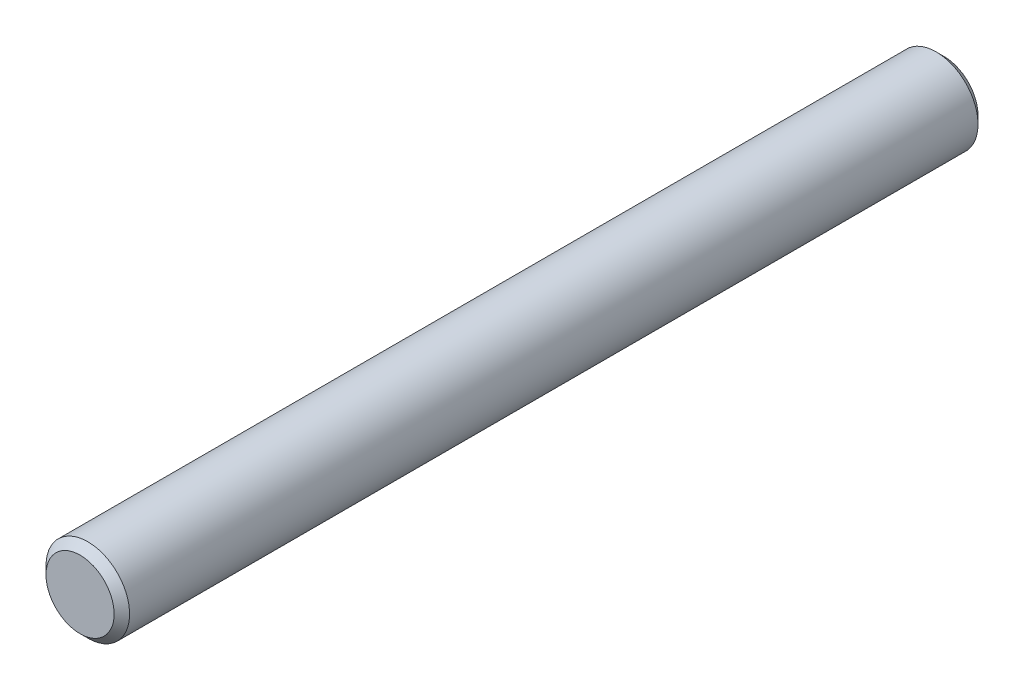
ISO-10303-21;
HEADER;
FILE_DESCRIPTION(('STEP AP214'),'2;1');
FILE_NAME('part.step','',(''),(''),'','','');
FILE_SCHEMA(('AUTOMOTIVE_DESIGN { 1 0 10303 214 1 1 1 1 }'));
ENDSEC;
DATA;
#1=APPLICATION_CONTEXT('core data for automotive mechanical design processes');
#2=APPLICATION_PROTOCOL_DEFINITION('international standard','automotive_design',2000,#1);
#3=PRODUCT_CONTEXT('',#1,'mechanical');
#4=PRODUCT('Part','Part','',(#3));
#5=PRODUCT_RELATED_PRODUCT_CATEGORY('part','',(#4));
#6=PRODUCT_DEFINITION_FORMATION('','',#4);
#7=PRODUCT_DEFINITION_CONTEXT('part definition',#1,'design');
#8=PRODUCT_DEFINITION('design','',#6,#7);
#9=PRODUCT_DEFINITION_SHAPE('','',#8);
#10=(LENGTH_UNIT() NAMED_UNIT(*) SI_UNIT(.MILLI.,.METRE.));
#11=(NAMED_UNIT(*) PLANE_ANGLE_UNIT() SI_UNIT($,.RADIAN.));
#12=(NAMED_UNIT(*) SI_UNIT($,.STERADIAN.) SOLID_ANGLE_UNIT());
#13=UNCERTAINTY_MEASURE_WITH_UNIT(LENGTH_MEASURE(1.E-05),#10,'distance_accuracy_value','');
#14=(GEOMETRIC_REPRESENTATION_CONTEXT(3) GLOBAL_UNCERTAINTY_ASSIGNED_CONTEXT((#13)) GLOBAL_UNIT_ASSIGNED_CONTEXT((#10,
#11,#12)) REPRESENTATION_CONTEXT('',''));
#15=CARTESIAN_POINT('',(0.,0.,0.));
#16=DIRECTION('',(0.,0.,1.));
#17=DIRECTION('',(1.,0.,0.));
#18=AXIS2_PLACEMENT_3D('',#15,#16,#17);
#19=CARTESIAN_POINT('',(0.,0.,21.));
#20=DIRECTION('',(0.,0.,-1.));
#21=DIRECTION('',(-1.,0.,0.));
#22=AXIS2_PLACEMENT_3D('',#19,#20,#21);
#23=CYLINDRICAL_SURFACE('',#22,3.);
#24=CARTESIAN_POINT('',(0.,0.,30.4455));
#25=DIRECTION('',(0.,0.,-1.));
#26=DIRECTION('',(-1.,0.,0.));
#27=AXIS2_PLACEMENT_3D('',#24,#25,#26);
#28=CIRCLE('',#27,3.);
#29=CARTESIAN_POINT('',(-3.,0.,30.4455));
#30=VERTEX_POINT('',#29);
#31=EDGE_CURVE('E45',#30,#30,#28,.T.);
#32=CARTESIAN_POINT('',(0.,0.,-30.4455));
#33=DIRECTION('',(0.,0.,1.));
#34=DIRECTION('',(1.,0.,0.));
#35=AXIS2_PLACEMENT_3D('',#32,#33,#34);
#36=CIRCLE('',#35,3.);
#37=CARTESIAN_POINT('',(-3.,0.,-30.4455));
#38=VERTEX_POINT('',#37);
#39=EDGE_CURVE('E53',#38,#38,#36,.T.);
#40=CARTESIAN_POINT('',(-3.,0.,30.4455));
#41=CARTESIAN_POINT('',(-3.,0.,29.81121875));
#42=CARTESIAN_POINT('',(-3.,0.,29.1769375));
#43=CARTESIAN_POINT('',(-3.,0.,27.908375));
#44=CARTESIAN_POINT('',(-3.,0.,27.27409375));
#45=CARTESIAN_POINT('',(-3.,0.,26.00553125));
#46=CARTESIAN_POINT('',(-3.,0.,25.37125));
#47=CARTESIAN_POINT('',(-3.,0.,24.1026875));
#48=CARTESIAN_POINT('',(-3.,0.,23.46840625));
#49=CARTESIAN_POINT('',(-3.,0.,22.19984375));
#50=CARTESIAN_POINT('',(-3.,0.,21.5655625));
#51=CARTESIAN_POINT('',(-3.,0.,20.297));
#52=CARTESIAN_POINT('',(-3.,0.,19.66271875));
#53=CARTESIAN_POINT('',(-3.,0.,18.39415625));
#54=CARTESIAN_POINT('',(-3.,0.,17.759875));
#55=CARTESIAN_POINT('',(-3.,0.,16.4913125));
#56=CARTESIAN_POINT('',(-3.,0.,15.85703125));
#57=CARTESIAN_POINT('',(-3.,0.,14.58846875));
#58=CARTESIAN_POINT('',(-3.,0.,13.9541875));
#59=CARTESIAN_POINT('',(-3.,0.,12.685625));
#60=CARTESIAN_POINT('',(-3.,0.,12.05134375));
#61=CARTESIAN_POINT('',(-3.,0.,10.78278125));
#62=CARTESIAN_POINT('',(-3.,0.,10.1485));
#63=CARTESIAN_POINT('',(-3.,0.,8.8799375));
#64=CARTESIAN_POINT('',(-3.,0.,8.24565625));
#65=CARTESIAN_POINT('',(-3.,0.,6.97709375));
#66=CARTESIAN_POINT('',(-3.,0.,6.3428125));
#67=CARTESIAN_POINT('',(-3.,0.,5.07425));
#68=CARTESIAN_POINT('',(-3.,0.,4.43996875));
#69=CARTESIAN_POINT('',(-3.,0.,3.17140625));
#70=CARTESIAN_POINT('',(-3.,0.,2.537125));
#71=CARTESIAN_POINT('',(-3.,0.,1.2685625));
#72=CARTESIAN_POINT('',(-3.,0.,0.63428125));
#73=CARTESIAN_POINT('',(-3.,0.,-0.63428125));
#74=CARTESIAN_POINT('',(-3.,0.,-1.2685625));
#75=CARTESIAN_POINT('',(-3.,0.,-2.537125));
#76=CARTESIAN_POINT('',(-3.,0.,-3.17140625));
#77=CARTESIAN_POINT('',(-3.,0.,-4.43996875));
#78=CARTESIAN_POINT('',(-3.,0.,-5.07425));
#79=CARTESIAN_POINT('',(-3.,0.,-6.3428125));
#80=CARTESIAN_POINT('',(-3.,0.,-6.97709375));
#81=CARTESIAN_POINT('',(-3.,0.,-8.24565625));
#82=CARTESIAN_POINT('',(-3.,0.,-8.8799375));
#83=CARTESIAN_POINT('',(-3.,0.,-10.1485));
#84=CARTESIAN_POINT('',(-3.,0.,-10.78278125));
#85=CARTESIAN_POINT('',(-3.,0.,-12.05134375));
#86=CARTESIAN_POINT('',(-3.,0.,-12.685625));
#87=CARTESIAN_POINT('',(-3.,0.,-13.9541875));
#88=CARTESIAN_POINT('',(-3.,0.,-14.58846875));
#89=CARTESIAN_POINT('',(-3.,0.,-15.85703125));
#90=CARTESIAN_POINT('',(-3.,0.,-16.4913125));
#91=CARTESIAN_POINT('',(-3.,0.,-17.759875));
#92=CARTESIAN_POINT('',(-3.,0.,-18.39415625));
#93=CARTESIAN_POINT('',(-3.,0.,-19.66271875));
#94=CARTESIAN_POINT('',(-3.,0.,-20.297));
#95=CARTESIAN_POINT('',(-3.,0.,-21.5655625));
#96=CARTESIAN_POINT('',(-3.,0.,-22.19984375));
#97=CARTESIAN_POINT('',(-3.,0.,-23.46840625));
#98=CARTESIAN_POINT('',(-3.,0.,-24.1026875));
#99=CARTESIAN_POINT('',(-3.,0.,-25.37125));
#100=CARTESIAN_POINT('',(-3.,0.,-26.00553125));
#101=CARTESIAN_POINT('',(-3.,0.,-27.27409375));
#102=CARTESIAN_POINT('',(-3.,0.,-27.908375));
#103=CARTESIAN_POINT('',(-3.,0.,-29.1769375));
#104=CARTESIAN_POINT('',(-3.,0.,-29.81121875));
#105=CARTESIAN_POINT('',(-3.,0.,-30.4455));
#106=B_SPLINE_CURVE_WITH_KNOTS('',3,(#40,#41,#42,#43,#44,#45,#46,#47,#48,#49,#50,#51,#52,#53,
#54,#55,#56,#57,#58,#59,#60,#61,#62,#63,#64,#65,#66,#67,#68,#69,#70,#71,#72,#73,#74,#75,#76,#77,
#78,#79,#80,#81,#82,#83,#84,#85,#86,#87,#88,#89,#90,#91,#92,#93,#94,#95,#96,#97,#98,#99,#100,
#101,#102,#103,#104,#105),.UNSPECIFIED.,.F.,.F.,(4,2,2,2,2,2,2,2,2,2,2,2,2,2,2,2,2,2,2,2,2,2,2,
2,2,2,2,2,2,2,2,2,4),(0.,1.90284375,3.8056875,5.70853125,7.611375,9.51421875,11.4170625,
13.31990625,15.22275,17.12559375,19.0284375,20.93128125,22.834125,24.73696875,26.6398125,
28.54265625,30.4455,32.34834375,34.2511875,36.15403125,38.056875,39.95971875,41.8625625,
43.76540625,45.66825,47.57109375,49.4739375,51.37678125,53.279625,55.18246875,57.0853125,
58.98815625,60.891),.UNSPECIFIED.);
#107=EDGE_CURVE('BSEAM39',#30,#38,#106,.T.);
#108=ORIENTED_EDGE('',*,*,#31,.T.);
#109=ORIENTED_EDGE('',*,*,#39,.T.);
#110=ORIENTED_EDGE('',*,*,#107,.T.);
#111=ORIENTED_EDGE('',*,*,#107,.F.);
#112=EDGE_LOOP('',(#108,#110,#109,#111));
#113=FACE_BOUND('',#112,.T.);
#114=ADVANCED_FACE('F39',(#113),#23,.T.);
#115=CARTESIAN_POINT('',(2.4455,0.,31.));
#116=DIRECTION('',(0.,0.,1.));
#117=DIRECTION('',(1.,0.,0.));
#118=AXIS2_PLACEMENT_3D('',#115,#116,#117);
#119=PLANE('',#118);
#120=CARTESIAN_POINT('',(0.,0.,31.));
#121=DIRECTION('',(0.,0.,-1.));
#122=DIRECTION('',(-1.,0.,0.));
#123=AXIS2_PLACEMENT_3D('',#120,#121,#122);
#124=CIRCLE('',#123,2.4455);
#125=CARTESIAN_POINT('',(-2.4455,0.,31.));
#126=VERTEX_POINT('',#125);
#127=EDGE_CURVE('E10',#126,#126,#124,.T.);
#128=ORIENTED_EDGE('',*,*,#127,.F.);
#129=EDGE_LOOP('',(#128));
#130=FACE_BOUND('',#129,.T.);
#131=ADVANCED_FACE('F72',(#130),#119,.T.);
#132=CARTESIAN_POINT('',(0.,0.,30.4455));
#133=DIRECTION('',(0.,0.,-1.));
#134=DIRECTION('',(-1.,0.,0.));
#135=AXIS2_PLACEMENT_3D('',#132,#133,#134);
#136=CONICAL_SURFACE('',#135,3.,0.785398163397451);
#137=ORIENTED_EDGE('',*,*,#127,.T.);
#138=EDGE_LOOP('',(#137));
#139=FACE_BOUND('',#138,.T.);
#140=ORIENTED_EDGE('',*,*,#31,.F.);
#141=EDGE_LOOP('',(#140));
#142=FACE_BOUND('',#141,.T.);
#143=ADVANCED_FACE('F68',(#139,#142),#136,.T.);
#144=CARTESIAN_POINT('',(2.4455,0.,-31.));
#145=DIRECTION('',(0.,0.,-1.));
#146=DIRECTION('',(-1.,0.,0.));
#147=AXIS2_PLACEMENT_3D('',#144,#145,#146);
#148=PLANE('',#147);
#149=CARTESIAN_POINT('',(0.,0.,-31.));
#150=DIRECTION('',(0.,0.,1.));
#151=DIRECTION('',(1.,0.,0.));
#152=AXIS2_PLACEMENT_3D('',#149,#150,#151);
#153=CIRCLE('',#152,2.4455);
#154=CARTESIAN_POINT('',(2.4455,0.,-31.));
#155=VERTEX_POINT('',#154);
#156=EDGE_CURVE('E49',#155,#155,#153,.T.);
#157=ORIENTED_EDGE('',*,*,#156,.F.);
#158=EDGE_LOOP('',(#157));
#159=FACE_BOUND('',#158,.T.);
#160=ADVANCED_FACE('F62',(#159),#148,.T.);
#161=CARTESIAN_POINT('',(0.,0.,-30.4455));
#162=DIRECTION('',(0.,0.,1.));
#163=DIRECTION('',(1.,0.,0.));
#164=AXIS2_PLACEMENT_3D('',#161,#162,#163);
#165=CONICAL_SURFACE('',#164,3.,0.785398163397451);
#166=ORIENTED_EDGE('',*,*,#156,.T.);
#167=EDGE_LOOP('',(#166));
#168=FACE_BOUND('',#167,.T.);
#169=ORIENTED_EDGE('',*,*,#39,.F.);
#170=EDGE_LOOP('',(#169));
#171=FACE_BOUND('',#170,.T.);
#172=ADVANCED_FACE('F60',(#168,#171),#165,.T.);
#173=CLOSED_SHELL('',(#114,#131,#143,#160,#172));
#174=MANIFOLD_SOLID_BREP('B2',#173);
#175=ADVANCED_BREP_SHAPE_REPRESENTATION('',(#18,#174),#14);
#176=SHAPE_DEFINITION_REPRESENTATION(#9,#175);
ENDSEC;
END-ISO-10303-21;
